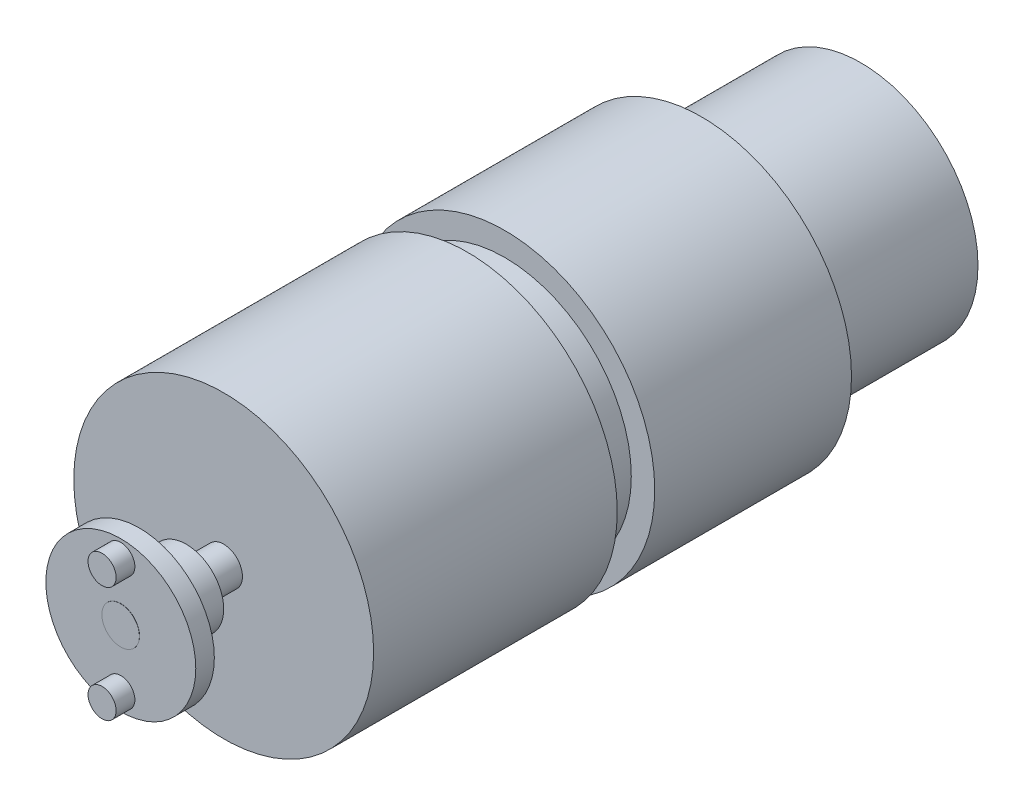
ISO-10303-21;
HEADER;
FILE_DESCRIPTION(('STEP AP214'),'2;1');
FILE_NAME('part.step','',(''),(''),'','','');
FILE_SCHEMA(('AUTOMOTIVE_DESIGN { 1 0 10303 214 1 1 1 1 }'));
ENDSEC;
DATA;
#1=APPLICATION_CONTEXT('core data for automotive mechanical design processes');
#2=APPLICATION_PROTOCOL_DEFINITION('international standard','automotive_design',2000,#1);
#3=PRODUCT_CONTEXT('',#1,'mechanical');
#4=PRODUCT('Part','Part','',(#3));
#5=PRODUCT_RELATED_PRODUCT_CATEGORY('part','',(#4));
#6=PRODUCT_DEFINITION_FORMATION('','',#4);
#7=PRODUCT_DEFINITION_CONTEXT('part definition',#1,'design');
#8=PRODUCT_DEFINITION('design','',#6,#7);
#9=PRODUCT_DEFINITION_SHAPE('','',#8);
#10=(LENGTH_UNIT() NAMED_UNIT(*) SI_UNIT(.MILLI.,.METRE.));
#11=(NAMED_UNIT(*) PLANE_ANGLE_UNIT() SI_UNIT($,.RADIAN.));
#12=(NAMED_UNIT(*) SI_UNIT($,.STERADIAN.) SOLID_ANGLE_UNIT());
#13=UNCERTAINTY_MEASURE_WITH_UNIT(LENGTH_MEASURE(1.E-05),#10,'distance_accuracy_value','');
#14=(GEOMETRIC_REPRESENTATION_CONTEXT(3) GLOBAL_UNCERTAINTY_ASSIGNED_CONTEXT((#13)) GLOBAL_UNIT_ASSIGNED_CONTEXT((#10,
#11,#12)) REPRESENTATION_CONTEXT('',''));
#15=CARTESIAN_POINT('',(0.,0.,0.));
#16=DIRECTION('',(0.,0.,1.));
#17=DIRECTION('',(1.,0.,0.));
#18=AXIS2_PLACEMENT_3D('',#15,#16,#17);
#19=CARTESIAN_POINT('',(0.,0.,78.98));
#20=DIRECTION('',(0.,0.,1.));
#21=DIRECTION('',(1.,0.,0.));
#22=AXIS2_PLACEMENT_3D('',#19,#20,#21);
#23=PLANE('',#22);
#24=CARTESIAN_POINT('',(0.,-6.15490487323545,78.98));
#25=DIRECTION('',(0.,0.,1.));
#26=DIRECTION('',(1.,0.,0.));
#27=AXIS2_PLACEMENT_3D('',#24,#25,#26);
#28=CIRCLE('',#27,1.5);
#29=CARTESIAN_POINT('',(1.5,-6.15490487323545,78.98));
#30=VERTEX_POINT('',#29);
#31=EDGE_CURVE('E73',#30,#30,#28,.T.);
#32=ORIENTED_EDGE('',*,*,#31,.F.);
#33=EDGE_LOOP('',(#32));
#34=FACE_BOUND('',#33,.T.);
#35=CARTESIAN_POINT('',(0.,0.,78.98));
#36=DIRECTION('',(0.,0.,1.));
#37=DIRECTION('',(1.,0.,0.));
#38=AXIS2_PLACEMENT_3D('',#35,#36,#37);
#39=CIRCLE('',#38,8.);
#40=CARTESIAN_POINT('',(8.,0.,78.98));
#41=VERTEX_POINT('',#40);
#42=EDGE_CURVE('E54',#41,#41,#39,.T.);
#43=ORIENTED_EDGE('',*,*,#42,.T.);
#44=EDGE_LOOP('',(#43));
#45=FACE_BOUND('',#44,.T.);
#46=CARTESIAN_POINT('',(0.,0.,78.98));
#47=DIRECTION('',(0.,0.,1.));
#48=DIRECTION('',(1.,0.,0.));
#49=AXIS2_PLACEMENT_3D('',#46,#47,#48);
#50=CIRCLE('',#49,2.);
#51=CARTESIAN_POINT('',(2.,0.,78.98));
#52=VERTEX_POINT('',#51);
#53=EDGE_CURVE('E51',#52,#52,#50,.T.);
#54=ORIENTED_EDGE('',*,*,#53,.F.);
#55=EDGE_LOOP('',(#54));
#56=FACE_BOUND('',#55,.T.);
#57=CARTESIAN_POINT('',(0.,6.15490487323545,78.98));
#58=DIRECTION('',(0.,0.,1.));
#59=DIRECTION('',(-1.,0.,0.));
#60=AXIS2_PLACEMENT_3D('',#57,#58,#59);
#61=CIRCLE('',#60,1.5);
#62=CARTESIAN_POINT('',(-1.5,6.15490487323545,78.98));
#63=VERTEX_POINT('',#62);
#64=EDGE_CURVE('E61',#63,#63,#61,.T.);
#65=ORIENTED_EDGE('',*,*,#64,.F.);
#66=EDGE_LOOP('',(#65));
#67=FACE_BOUND('',#66,.T.);
#68=ADVANCED_FACE('F34',(#34,#45,#56,#67),#23,.T.);
#69=CARTESIAN_POINT('',(0.,0.,79.));
#70=DIRECTION('',(0.,0.,-1.));
#71=DIRECTION('',(-1.,0.,0.));
#72=AXIS2_PLACEMENT_3D('',#69,#70,#71);
#73=CYLINDRICAL_SURFACE('',#72,2.);
#74=CARTESIAN_POINT('',(0.,0.,68.));
#75=DIRECTION('',(0.,0.,1.));
#76=DIRECTION('',(1.,0.,0.));
#77=AXIS2_PLACEMENT_3D('',#74,#75,#76);
#78=CIRCLE('',#77,2.);
#79=CARTESIAN_POINT('',(2.,0.,68.));
#80=VERTEX_POINT('',#79);
#81=EDGE_CURVE('E89',#80,#80,#78,.T.);
#82=ORIENTED_EDGE('',*,*,#81,.T.);
#83=EDGE_LOOP('',(#82));
#84=FACE_BOUND('',#83,.T.);
#85=CARTESIAN_POINT('',(0.,0.,72.));
#86=DIRECTION('',(0.,0.,1.));
#87=DIRECTION('',(1.,0.,0.));
#88=AXIS2_PLACEMENT_3D('',#85,#86,#87);
#89=CIRCLE('',#88,2.);
#90=CARTESIAN_POINT('',(2.,0.,72.));
#91=VERTEX_POINT('',#90);
#92=EDGE_CURVE('E10',#91,#91,#89,.T.);
#93=ORIENTED_EDGE('',*,*,#92,.F.);
#94=EDGE_LOOP('',(#93));
#95=FACE_BOUND('',#94,.T.);
#96=ADVANCED_FACE('F129',(#84,#95),#73,.T.);
#97=CARTESIAN_POINT('',(0.,0.,68.));
#98=DIRECTION('',(0.,0.,1.));
#99=DIRECTION('',(1.,0.,0.));
#100=AXIS2_PLACEMENT_3D('',#97,#98,#99);
#101=PLANE('',#100);
#102=CARTESIAN_POINT('',(0.,0.,68.));
#103=DIRECTION('',(0.,0.,1.));
#104=DIRECTION('',(1.,0.,0.));
#105=AXIS2_PLACEMENT_3D('',#102,#103,#104);
#106=CIRCLE('',#105,16.);
#107=CARTESIAN_POINT('',(16.,0.,68.));
#108=VERTEX_POINT('',#107);
#109=EDGE_CURVE('E98',#108,#108,#106,.T.);
#110=ORIENTED_EDGE('',*,*,#109,.T.);
#111=EDGE_LOOP('',(#110));
#112=FACE_BOUND('',#111,.T.);
#113=ORIENTED_EDGE('',*,*,#81,.F.);
#114=EDGE_LOOP('',(#113));
#115=FACE_BOUND('',#114,.T.);
#116=ADVANCED_FACE('F135',(#112,#115),#101,.T.);
#117=CARTESIAN_POINT('',(0.,0.,68.));
#118=DIRECTION('',(0.,0.,-1.));
#119=DIRECTION('',(-1.,0.,0.));
#120=AXIS2_PLACEMENT_3D('',#117,#118,#119);
#121=CYLINDRICAL_SURFACE('',#120,16.);
#122=CARTESIAN_POINT('',(0.,0.,42.));
#123=DIRECTION('',(0.,0.,1.));
#124=DIRECTION('',(1.,0.,0.));
#125=AXIS2_PLACEMENT_3D('',#122,#123,#124);
#126=CIRCLE('',#125,16.);
#127=CARTESIAN_POINT('',(16.,0.,42.));
#128=VERTEX_POINT('',#127);
#129=EDGE_CURVE('E38',#128,#128,#126,.T.);
#130=ORIENTED_EDGE('',*,*,#129,.T.);
#131=EDGE_LOOP('',(#130));
#132=FACE_BOUND('',#131,.T.);
#133=ORIENTED_EDGE('',*,*,#109,.F.);
#134=EDGE_LOOP('',(#133));
#135=FACE_BOUND('',#134,.T.);
#136=ADVANCED_FACE('F158',(#132,#135),#121,.T.);
#137=CARTESIAN_POINT('',(0.,0.,72.));
#138=DIRECTION('',(0.,0.,1.));
#139=DIRECTION('',(1.,0.,0.));
#140=AXIS2_PLACEMENT_3D('',#137,#138,#139);
#141=PLANE('',#140);
#142=CARTESIAN_POINT('',(0.,0.,72.));
#143=DIRECTION('',(0.,0.,1.));
#144=DIRECTION('',(1.,0.,0.));
#145=AXIS2_PLACEMENT_3D('',#142,#143,#144);
#146=CIRCLE('',#145,4.);
#147=CARTESIAN_POINT('',(4.,0.,72.));
#148=VERTEX_POINT('',#147);
#149=EDGE_CURVE('E53',#148,#148,#146,.T.);
#150=ORIENTED_EDGE('',*,*,#149,.F.);
#151=EDGE_LOOP('',(#150));
#152=FACE_BOUND('',#151,.T.);
#153=ORIENTED_EDGE('',*,*,#92,.T.);
#154=EDGE_LOOP('',(#153));
#155=FACE_BOUND('',#154,.T.);
#156=ADVANCED_FACE('F155',(#152,#155),#141,.F.);
#157=CARTESIAN_POINT('',(0.,0.,77.));
#158=DIRECTION('',(0.,0.,-1.));
#159=DIRECTION('',(-1.,0.,0.));
#160=AXIS2_PLACEMENT_3D('',#157,#158,#159);
#161=CYLINDRICAL_SURFACE('',#160,4.);
#162=CARTESIAN_POINT('',(0.,0.,77.));
#163=DIRECTION('',(0.,0.,1.));
#164=DIRECTION('',(1.,0.,0.));
#165=AXIS2_PLACEMENT_3D('',#162,#163,#164);
#166=CIRCLE('',#165,4.);
#167=CARTESIAN_POINT('',(4.,0.,77.));
#168=VERTEX_POINT('',#167);
#169=EDGE_CURVE('E86',#168,#168,#166,.T.);
#170=ORIENTED_EDGE('',*,*,#169,.F.);
#171=EDGE_LOOP('',(#170));
#172=FACE_BOUND('',#171,.T.);
#173=ORIENTED_EDGE('',*,*,#149,.T.);
#174=EDGE_LOOP('',(#173));
#175=FACE_BOUND('',#174,.T.);
#176=ADVANCED_FACE('F149',(#172,#175),#161,.T.);
#177=CARTESIAN_POINT('',(0.,0.,77.));
#178=DIRECTION('',(0.,0.,1.));
#179=DIRECTION('',(1.,0.,0.));
#180=AXIS2_PLACEMENT_3D('',#177,#178,#179);
#181=PLANE('',#180);
#182=CARTESIAN_POINT('',(0.,0.,77.));
#183=DIRECTION('',(0.,0.,1.));
#184=DIRECTION('',(1.,0.,0.));
#185=AXIS2_PLACEMENT_3D('',#182,#183,#184);
#186=CIRCLE('',#185,8.);
#187=CARTESIAN_POINT('',(8.,0.,77.));
#188=VERTEX_POINT('',#187);
#189=EDGE_CURVE('E79',#188,#188,#186,.T.);
#190=ORIENTED_EDGE('',*,*,#189,.F.);
#191=EDGE_LOOP('',(#190));
#192=FACE_BOUND('',#191,.T.);
#193=ORIENTED_EDGE('',*,*,#169,.T.);
#194=EDGE_LOOP('',(#193));
#195=FACE_BOUND('',#194,.T.);
#196=ADVANCED_FACE('F145',(#192,#195),#181,.F.);
#197=CARTESIAN_POINT('',(0.,0.,78.98));
#198=DIRECTION('',(0.,0.,-1.));
#199=DIRECTION('',(-1.,0.,0.));
#200=AXIS2_PLACEMENT_3D('',#197,#198,#199);
#201=CYLINDRICAL_SURFACE('',#200,8.);
#202=ORIENTED_EDGE('',*,*,#42,.F.);
#203=EDGE_LOOP('',(#202));
#204=FACE_BOUND('',#203,.T.);
#205=ORIENTED_EDGE('',*,*,#189,.T.);
#206=EDGE_LOOP('',(#205));
#207=FACE_BOUND('',#206,.T.);
#208=ADVANCED_FACE('F148',(#204,#207),#201,.T.);
#209=CARTESIAN_POINT('',(0.,0.,79.));
#210=DIRECTION('',(0.,0.,1.));
#211=DIRECTION('',(1.,0.,0.));
#212=AXIS2_PLACEMENT_3D('',#209,#210,#211);
#213=PLANE('',#212);
#214=CARTESIAN_POINT('',(0.,0.,79.));
#215=DIRECTION('',(0.,0.,1.));
#216=DIRECTION('',(1.,0.,0.));
#217=AXIS2_PLACEMENT_3D('',#214,#215,#216);
#218=CIRCLE('',#217,2.);
#219=CARTESIAN_POINT('',(2.,0.,79.));
#220=VERTEX_POINT('',#219);
#221=EDGE_CURVE('E92',#220,#220,#218,.T.);
#222=ORIENTED_EDGE('',*,*,#221,.T.);
#223=EDGE_LOOP('',(#222));
#224=FACE_BOUND('',#223,.T.);
#225=ADVANCED_FACE('F153',(#224),#213,.T.);
#226=ORIENTED_EDGE('',*,*,#53,.T.);
#227=EDGE_LOOP('',(#226));
#228=FACE_BOUND('',#227,.T.);
#229=ORIENTED_EDGE('',*,*,#221,.F.);
#230=EDGE_LOOP('',(#229));
#231=FACE_BOUND('',#230,.T.);
#232=ADVANCED_FACE('F138',(#228,#231),#73,.T.);
#233=CARTESIAN_POINT('',(0.,-6.15490487323545,80.98));
#234=DIRECTION('',(0.,0.,-1.));
#235=DIRECTION('',(-1.,0.,0.));
#236=AXIS2_PLACEMENT_3D('',#233,#234,#235);
#237=CYLINDRICAL_SURFACE('',#236,1.5);
#238=CARTESIAN_POINT('',(0.,-6.15490487323545,80.98));
#239=DIRECTION('',(0.,0.,1.));
#240=DIRECTION('',(1.,0.,0.));
#241=AXIS2_PLACEMENT_3D('',#238,#239,#240);
#242=CIRCLE('',#241,1.5);
#243=CARTESIAN_POINT('',(1.5,-6.15490487323545,80.98));
#244=VERTEX_POINT('',#243);
#245=EDGE_CURVE('E76',#244,#244,#242,.T.);
#246=ORIENTED_EDGE('',*,*,#245,.F.);
#247=EDGE_LOOP('',(#246));
#248=FACE_BOUND('',#247,.T.);
#249=ORIENTED_EDGE('',*,*,#31,.T.);
#250=EDGE_LOOP('',(#249));
#251=FACE_BOUND('',#250,.T.);
#252=ADVANCED_FACE('F143',(#248,#251),#237,.T.);
#253=CARTESIAN_POINT('',(0.,-6.15490487323545,80.98));
#254=DIRECTION('',(0.,0.,1.));
#255=DIRECTION('',(1.,0.,0.));
#256=AXIS2_PLACEMENT_3D('',#253,#254,#255);
#257=PLANE('',#256);
#258=ORIENTED_EDGE('',*,*,#245,.T.);
#259=EDGE_LOOP('',(#258));
#260=FACE_BOUND('',#259,.T.);
#261=ADVANCED_FACE('F257',(#260),#257,.T.);
#262=CARTESIAN_POINT('',(0.,6.15490487323545,80.98));
#263=DIRECTION('',(0.,0.,-1.));
#264=DIRECTION('',(-1.,0.,0.));
#265=AXIS2_PLACEMENT_3D('',#262,#263,#264);
#266=CYLINDRICAL_SURFACE('',#265,1.5);
#267=CARTESIAN_POINT('',(0.,6.15490487323545,80.98));
#268=DIRECTION('',(0.,0.,1.));
#269=DIRECTION('',(-1.,0.,0.));
#270=AXIS2_PLACEMENT_3D('',#267,#268,#269);
#271=CIRCLE('',#270,1.5);
#272=CARTESIAN_POINT('',(-1.5,6.15490487323545,80.98));
#273=VERTEX_POINT('',#272);
#274=EDGE_CURVE('E70',#273,#273,#271,.T.);
#275=ORIENTED_EDGE('',*,*,#274,.F.);
#276=EDGE_LOOP('',(#275));
#277=FACE_BOUND('',#276,.T.);
#278=ORIENTED_EDGE('',*,*,#64,.T.);
#279=EDGE_LOOP('',(#278));
#280=FACE_BOUND('',#279,.T.);
#281=ADVANCED_FACE('F266',(#277,#280),#266,.T.);
#282=CARTESIAN_POINT('',(0.,6.15490487323545,80.98));
#283=DIRECTION('',(0.,0.,-1.));
#284=DIRECTION('',(-1.,0.,0.));
#285=AXIS2_PLACEMENT_3D('',#282,#283,#284);
#286=PLANE('',#285);
#287=ORIENTED_EDGE('',*,*,#274,.T.);
#288=EDGE_LOOP('',(#287));
#289=FACE_BOUND('',#288,.T.);
#290=ADVANCED_FACE('F275',(#289),#286,.F.);
#291=CARTESIAN_POINT('',(0.,0.,42.));
#292=DIRECTION('',(0.,0.,1.));
#293=DIRECTION('',(1.,0.,0.));
#294=AXIS2_PLACEMENT_3D('',#291,#292,#293);
#295=PLANE('',#294);
#296=CARTESIAN_POINT('',(0.,0.,42.));
#297=DIRECTION('',(0.,0.,1.));
#298=DIRECTION('',(1.,0.,0.));
#299=AXIS2_PLACEMENT_3D('',#296,#297,#298);
#300=CIRCLE('',#299,13.5);
#301=CARTESIAN_POINT('',(13.5,0.,42.));
#302=VERTEX_POINT('',#301);
#303=EDGE_CURVE('E57',#302,#302,#300,.T.);
#304=ORIENTED_EDGE('',*,*,#303,.T.);
#305=EDGE_LOOP('',(#304));
#306=FACE_BOUND('',#305,.T.);
#307=ORIENTED_EDGE('',*,*,#129,.F.);
#308=EDGE_LOOP('',(#307));
#309=FACE_BOUND('',#308,.T.);
#310=ADVANCED_FACE('F284',(#306,#309),#295,.F.);
#311=CARTESIAN_POINT('',(0.,0.,38.));
#312=DIRECTION('',(0.,0.,1.));
#313=DIRECTION('',(1.,0.,0.));
#314=AXIS2_PLACEMENT_3D('',#311,#312,#313);
#315=PLANE('',#314);
#316=CARTESIAN_POINT('',(0.,0.,38.));
#317=DIRECTION('',(0.,0.,1.));
#318=DIRECTION('',(1.,0.,0.));
#319=AXIS2_PLACEMENT_3D('',#316,#317,#318);
#320=CIRCLE('',#319,13.5);
#321=CARTESIAN_POINT('',(13.5,0.,38.));
#322=VERTEX_POINT('',#321);
#323=EDGE_CURVE('E63',#322,#322,#320,.T.);
#324=ORIENTED_EDGE('',*,*,#323,.F.);
#325=EDGE_LOOP('',(#324));
#326=FACE_BOUND('',#325,.T.);
#327=CARTESIAN_POINT('',(0.,0.,38.));
#328=DIRECTION('',(0.,0.,1.));
#329=DIRECTION('',(1.,0.,0.));
#330=AXIS2_PLACEMENT_3D('',#327,#328,#329);
#331=CIRCLE('',#330,16.);
#332=CARTESIAN_POINT('',(16.,0.,38.));
#333=VERTEX_POINT('',#332);
#334=EDGE_CURVE('E55',#333,#333,#331,.T.);
#335=ORIENTED_EDGE('',*,*,#334,.T.);
#336=EDGE_LOOP('',(#335));
#337=FACE_BOUND('',#336,.T.);
#338=ADVANCED_FACE('F124',(#326,#337),#315,.T.);
#339=CARTESIAN_POINT('',(0.,0.,42.));
#340=DIRECTION('',(0.,0.,-1.));
#341=DIRECTION('',(-1.,0.,0.));
#342=AXIS2_PLACEMENT_3D('',#339,#340,#341);
#343=CYLINDRICAL_SURFACE('',#342,13.5);
#344=ORIENTED_EDGE('',*,*,#303,.F.);
#345=EDGE_LOOP('',(#344));
#346=FACE_BOUND('',#345,.T.);
#347=ORIENTED_EDGE('',*,*,#323,.T.);
#348=EDGE_LOOP('',(#347));
#349=FACE_BOUND('',#348,.T.);
#350=ADVANCED_FACE('F120',(#346,#349),#343,.T.);
#351=CARTESIAN_POINT('',(0.,0.,0.));
#352=DIRECTION('',(0.,0.,1.));
#353=DIRECTION('',(1.,0.,0.));
#354=AXIS2_PLACEMENT_3D('',#351,#352,#353);
#355=PLANE('',#354);
#356=CARTESIAN_POINT('',(0.,0.,0.));
#357=DIRECTION('',(0.,0.,1.));
#358=DIRECTION('',(1.,0.,0.));
#359=AXIS2_PLACEMENT_3D('',#356,#357,#358);
#360=CIRCLE('',#359,12.5);
#361=CARTESIAN_POINT('',(12.5,0.,0.));
#362=VERTEX_POINT('',#361);
#363=EDGE_CURVE('E47',#362,#362,#360,.T.);
#364=ORIENTED_EDGE('',*,*,#363,.F.);
#365=EDGE_LOOP('',(#364));
#366=FACE_BOUND('',#365,.T.);
#367=ADVANCED_FACE('F115',(#366),#355,.F.);
#368=CARTESIAN_POINT('',(0.,0.,17.));
#369=DIRECTION('',(0.,0.,-1.));
#370=DIRECTION('',(-1.,0.,0.));
#371=AXIS2_PLACEMENT_3D('',#368,#369,#370);
#372=CYLINDRICAL_SURFACE('',#371,12.5);
#373=CARTESIAN_POINT('',(0.,0.,17.));
#374=DIRECTION('',(0.,0.,1.));
#375=DIRECTION('',(1.,0.,0.));
#376=AXIS2_PLACEMENT_3D('',#373,#374,#375);
#377=CIRCLE('',#376,12.5);
#378=CARTESIAN_POINT('',(12.5,0.,17.));
#379=VERTEX_POINT('',#378);
#380=EDGE_CURVE('E42',#379,#379,#377,.T.);
#381=ORIENTED_EDGE('',*,*,#380,.F.);
#382=EDGE_LOOP('',(#381));
#383=FACE_BOUND('',#382,.T.);
#384=ORIENTED_EDGE('',*,*,#363,.T.);
#385=EDGE_LOOP('',(#384));
#386=FACE_BOUND('',#385,.T.);
#387=ADVANCED_FACE('F36',(#383,#386),#372,.T.);
#388=CARTESIAN_POINT('',(0.,0.,17.));
#389=DIRECTION('',(0.,0.,1.));
#390=DIRECTION('',(1.,0.,0.));
#391=AXIS2_PLACEMENT_3D('',#388,#389,#390);
#392=PLANE('',#391);
#393=CARTESIAN_POINT('',(0.,0.,17.));
#394=DIRECTION('',(0.,0.,1.));
#395=DIRECTION('',(1.,0.,0.));
#396=AXIS2_PLACEMENT_3D('',#393,#394,#395);
#397=CIRCLE('',#396,16.);
#398=CARTESIAN_POINT('',(16.,0.,17.));
#399=VERTEX_POINT('',#398);
#400=EDGE_CURVE('E95',#399,#399,#397,.T.);
#401=ORIENTED_EDGE('',*,*,#400,.F.);
#402=EDGE_LOOP('',(#401));
#403=FACE_BOUND('',#402,.T.);
#404=ORIENTED_EDGE('',*,*,#380,.T.);
#405=EDGE_LOOP('',(#404));
#406=FACE_BOUND('',#405,.T.);
#407=ADVANCED_FACE('F107',(#403,#406),#392,.F.);
#408=ORIENTED_EDGE('',*,*,#400,.T.);
#409=EDGE_LOOP('',(#408));
#410=FACE_BOUND('',#409,.T.);
#411=ORIENTED_EDGE('',*,*,#334,.F.);
#412=EDGE_LOOP('',(#411));
#413=FACE_BOUND('',#412,.T.);
#414=ADVANCED_FACE('F104',(#410,#413),#121,.T.);
#415=CLOSED_SHELL('',(#68,#96,#116,#136,#156,#176,#196,#208,#225,#232,#252,#261,#281,#290,#310,
#338,#350,#367,#387,#407,#414));
#416=MANIFOLD_SOLID_BREP('B2',#415);
#417=ADVANCED_BREP_SHAPE_REPRESENTATION('',(#18,#416),#14);
#418=SHAPE_DEFINITION_REPRESENTATION(#9,#417);
ENDSEC;
END-ISO-10303-21;
